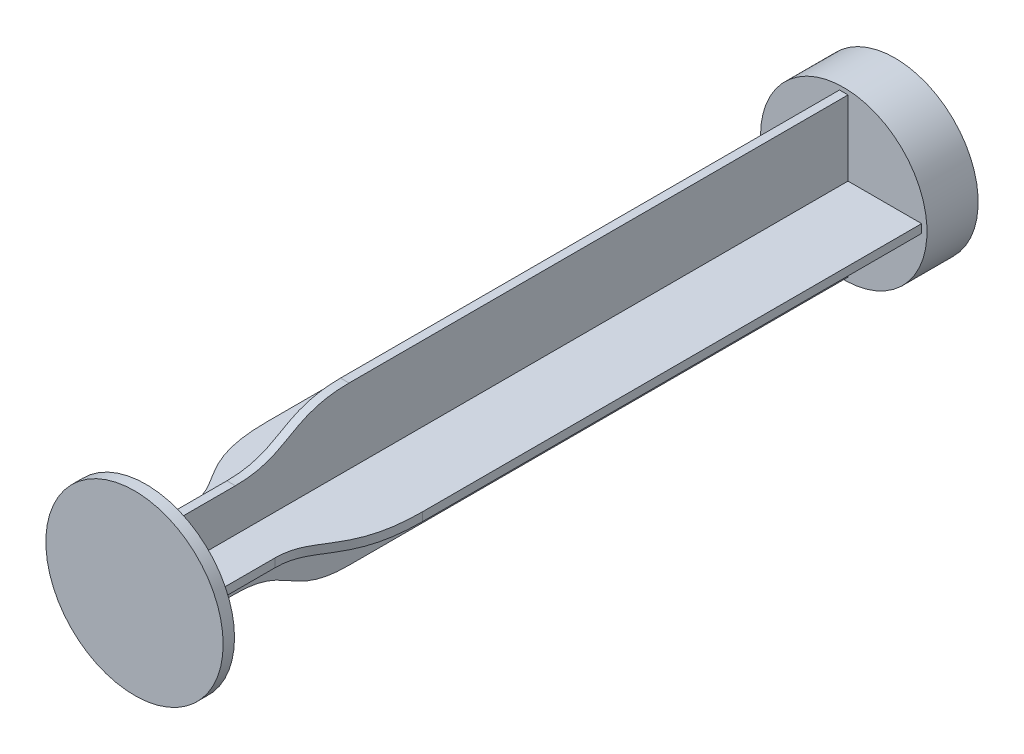
ISO-10303-21;
HEADER;
FILE_DESCRIPTION(('STEP AP214'),'2;1');
FILE_NAME('part.step','',(''),(''),'','','');
FILE_SCHEMA(('AUTOMOTIVE_DESIGN { 1 0 10303 214 1 1 1 1 }'));
ENDSEC;
DATA;
#1=APPLICATION_CONTEXT('core data for automotive mechanical design processes');
#2=APPLICATION_PROTOCOL_DEFINITION('international standard','automotive_design',2000,#1);
#3=PRODUCT_CONTEXT('',#1,'mechanical');
#4=PRODUCT('Part','Part','',(#3));
#5=PRODUCT_RELATED_PRODUCT_CATEGORY('part','',(#4));
#6=PRODUCT_DEFINITION_FORMATION('','',#4);
#7=PRODUCT_DEFINITION_CONTEXT('part definition',#1,'design');
#8=PRODUCT_DEFINITION('design','',#6,#7);
#9=PRODUCT_DEFINITION_SHAPE('','',#8);
#10=(LENGTH_UNIT() NAMED_UNIT(*) SI_UNIT(.MILLI.,.METRE.));
#11=(NAMED_UNIT(*) PLANE_ANGLE_UNIT() SI_UNIT($,.RADIAN.));
#12=(NAMED_UNIT(*) SI_UNIT($,.STERADIAN.) SOLID_ANGLE_UNIT());
#13=UNCERTAINTY_MEASURE_WITH_UNIT(LENGTH_MEASURE(1.E-05),#10,'distance_accuracy_value','');
#14=(GEOMETRIC_REPRESENTATION_CONTEXT(3) GLOBAL_UNCERTAINTY_ASSIGNED_CONTEXT((#13)) GLOBAL_UNIT_ASSIGNED_CONTEXT((#10,
#11,#12)) REPRESENTATION_CONTEXT('',''));
#15=CARTESIAN_POINT('',(0.,0.,0.));
#16=DIRECTION('',(0.,0.,1.));
#17=DIRECTION('',(1.,0.,0.));
#18=AXIS2_PLACEMENT_3D('',#15,#16,#17);
#19=CARTESIAN_POINT('',(-0.750000000000001,-0.75,39.0138466948438));
#20=DIRECTION('',(0.,-1.,0.));
#21=DIRECTION('',(1.,0.,0.));
#22=AXIS2_PLACEMENT_3D('',#19,#20,#21);
#23=PLANE('',#22);
#24=DIRECTION('',(-1.,0.,0.));
#25=VECTOR('',#24,1.);
#26=CARTESIAN_POINT('',(-0.750000000000001,-0.75,0.));
#27=LINE('',#26,#25);
#28=CARTESIAN_POINT('',(-0.750000000000001,-0.749999999999999,0.));
#29=VERTEX_POINT('',#28);
#30=CARTESIAN_POINT('',(-7.75,-0.749999999999997,0.));
#31=VERTEX_POINT('',#30);
#32=EDGE_CURVE('E219',#29,#31,#27,.T.);
#33=ORIENTED_EDGE('',*,*,#32,.T.);
#34=DIRECTION('',(0.,0.,-1.));
#35=VECTOR('',#34,1.);
#36=CARTESIAN_POINT('',(-7.75,-0.749999999999997,0.));
#37=LINE('',#36,#35);
#38=CARTESIAN_POINT('',(-7.75,-0.749999999999997,-15.));
#39=VERTEX_POINT('',#38);
#40=EDGE_CURVE('E627',#31,#39,#37,.T.);
#41=ORIENTED_EDGE('',*,*,#40,.T.);
#42=CARTESIAN_POINT('',(-7.75,-0.749999999999997,-15.));
#43=CARTESIAN_POINT('',(-7.75,-0.749999999999997,-21.9666750683278));
#44=CARTESIAN_POINT('',(-13.7,-0.749999999999995,-21.9666750683278));
#45=CARTESIAN_POINT('',(-13.7,-0.749999999999995,-35.));
#46=B_SPLINE_CURVE_WITH_KNOTS('',3,(#42,#43,#44,#45),.UNSPECIFIED.,.F.,.F.,(4,4),(0.,1.),.UNSPECIFIED.);
#47=CARTESIAN_POINT('',(-13.7,-0.749999999999995,-35.));
#48=VERTEX_POINT('',#47);
#49=EDGE_CURVE('E630',#39,#48,#46,.T.);
#50=ORIENTED_EDGE('',*,*,#49,.T.);
#51=DIRECTION('',(0.,0.,-1.));
#52=VECTOR('',#51,1.);
#53=CARTESIAN_POINT('',(-13.7,-0.750000000000004,39.0138466948438));
#54=LINE('',#53,#52);
#55=CARTESIAN_POINT('',(-13.7,-0.750000000000004,-122.8));
#56=VERTEX_POINT('',#55);
#57=EDGE_CURVE('E217',#48,#56,#54,.T.);
#58=ORIENTED_EDGE('',*,*,#57,.T.);
#59=DIRECTION('',(-1.,0.,0.));
#60=VECTOR('',#59,1.);
#61=CARTESIAN_POINT('',(-0.750000000000001,-0.75,-122.8));
#62=LINE('',#61,#60);
#63=CARTESIAN_POINT('',(-0.750000000000001,-0.75,-122.8));
#64=VERTEX_POINT('',#63);
#65=EDGE_CURVE('E298',#64,#56,#62,.T.);
#66=ORIENTED_EDGE('',*,*,#65,.F.);
#67=DIRECTION('',(0.,0.,-1.));
#68=VECTOR('',#67,1.);
#69=CARTESIAN_POINT('',(-0.750000000000001,-0.75,39.0138466948438));
#70=LINE('',#69,#68);
#71=EDGE_CURVE('E220',#29,#64,#70,.T.);
#72=ORIENTED_EDGE('',*,*,#71,.F.);
#73=EDGE_LOOP('',(#33,#41,#50,#58,#66,#72));
#74=FACE_BOUND('',#73,.T.);
#75=ADVANCED_FACE('F39',(#74),#23,.T.);
#76=CARTESIAN_POINT('',(-13.7,-0.750000000000004,39.0138466948438));
#77=DIRECTION('',(-1.,0.,0.));
#78=DIRECTION('',(0.,0.,1.));
#79=AXIS2_PLACEMENT_3D('',#76,#77,#78);
#80=PLANE('',#79);
#81=ORIENTED_EDGE('',*,*,#57,.F.);
#82=DIRECTION('',(0.,-1.,0.));
#83=VECTOR('',#82,1.);
#84=CARTESIAN_POINT('',(-13.7,38.2134110764713,-35.));
#85=LINE('',#84,#83);
#86=CARTESIAN_POINT('',(-13.7,0.749999999999994,-35.));
#87=VERTEX_POINT('',#86);
#88=EDGE_CURVE('E628',#87,#48,#85,.T.);
#89=ORIENTED_EDGE('',*,*,#88,.F.);
#90=DIRECTION('',(0.,0.,-1.));
#91=VECTOR('',#90,1.);
#92=CARTESIAN_POINT('',(-13.7,0.749999999999996,39.0138466948438));
#93=LINE('',#92,#91);
#94=CARTESIAN_POINT('',(-13.7,0.749999999999996,-122.8));
#95=VERTEX_POINT('',#94);
#96=EDGE_CURVE('E215',#87,#95,#93,.T.);
#97=ORIENTED_EDGE('',*,*,#96,.T.);
#98=DIRECTION('',(0.,1.,0.));
#99=VECTOR('',#98,1.);
#100=CARTESIAN_POINT('',(-13.7,-0.750000000000004,-122.8));
#101=LINE('',#100,#99);
#102=EDGE_CURVE('E295',#56,#95,#101,.T.);
#103=ORIENTED_EDGE('',*,*,#102,.F.);
#104=EDGE_LOOP('',(#81,#89,#97,#103));
#105=FACE_BOUND('',#104,.T.);
#106=ADVANCED_FACE('F412',(#105),#80,.T.);
#107=CARTESIAN_POINT('',(-0.750000000000001,0.75,39.0138466948438));
#108=DIRECTION('',(0.,1.,0.));
#109=DIRECTION('',(-1.,0.,0.));
#110=AXIS2_PLACEMENT_3D('',#107,#108,#109);
#111=PLANE('',#110);
#112=CARTESIAN_POINT('',(-7.75,0.750000000000008,-15.));
#113=CARTESIAN_POINT('',(-7.75,0.750000000000008,-21.9666750683278));
#114=CARTESIAN_POINT('',(-13.7,0.750000000000008,-21.9666750683278));
#115=CARTESIAN_POINT('',(-13.7,0.750000000000008,-35.));
#116=B_SPLINE_CURVE_WITH_KNOTS('',3,(#112,#113,#114,#115),.UNSPECIFIED.,.F.,.F.,(4,4),(0.,1.),.UNSPECIFIED.);
#117=CARTESIAN_POINT('',(-7.75,0.750000000000008,-15.));
#118=VERTEX_POINT('',#117);
#119=EDGE_CURVE('E634',#118,#87,#116,.T.);
#120=ORIENTED_EDGE('',*,*,#119,.F.);
#121=DIRECTION('',(0.,0.,-1.));
#122=VECTOR('',#121,1.);
#123=CARTESIAN_POINT('',(-7.75,0.749999999999994,0.));
#124=LINE('',#123,#122);
#125=CARTESIAN_POINT('',(-7.74999999999999,0.749999999999991,0.));
#126=VERTEX_POINT('',#125);
#127=EDGE_CURVE('E335',#126,#118,#124,.T.);
#128=ORIENTED_EDGE('',*,*,#127,.F.);
#129=DIRECTION('',(1.,0.,0.));
#130=VECTOR('',#129,1.);
#131=CARTESIAN_POINT('',(-0.750000000000001,0.75,0.));
#132=LINE('',#131,#130);
#133=CARTESIAN_POINT('',(-0.750000000000001,0.75,0.));
#134=VERTEX_POINT('',#133);
#135=EDGE_CURVE('E214',#126,#134,#132,.T.);
#136=ORIENTED_EDGE('',*,*,#135,.T.);
#137=DIRECTION('',(0.,0.,-1.));
#138=VECTOR('',#137,1.);
#139=CARTESIAN_POINT('',(-0.750000000000001,0.75,39.0138466948438));
#140=LINE('',#139,#138);
#141=CARTESIAN_POINT('',(-0.750000000000001,0.75,-122.8));
#142=VERTEX_POINT('',#141);
#143=EDGE_CURVE('E210',#134,#142,#140,.T.);
#144=ORIENTED_EDGE('',*,*,#143,.T.);
#145=DIRECTION('',(1.,0.,0.));
#146=VECTOR('',#145,1.);
#147=CARTESIAN_POINT('',(-0.750000000000001,0.75,-122.8));
#148=LINE('',#147,#146);
#149=EDGE_CURVE('E232',#95,#142,#148,.T.);
#150=ORIENTED_EDGE('',*,*,#149,.F.);
#151=ORIENTED_EDGE('',*,*,#96,.F.);
#152=EDGE_LOOP('',(#120,#128,#136,#144,#150,#151));
#153=FACE_BOUND('',#152,.T.);
#154=ADVANCED_FACE('F330',(#153),#111,.T.);
#155=CARTESIAN_POINT('',(0.75,13.8863263133989,39.0138466948438));
#156=DIRECTION('',(0.,1.,0.));
#157=DIRECTION('',(0.,0.,1.));
#158=AXIS2_PLACEMENT_3D('',#155,#156,#157);
#159=PLANE('',#158);
#160=DIRECTION('',(0.,0.,-1.));
#161=VECTOR('',#160,1.);
#162=CARTESIAN_POINT('',(-0.75,13.8863263133989,39.0138466948438));
#163=LINE('',#162,#161);
#164=CARTESIAN_POINT('',(-0.75,13.8863263133989,-35.));
#165=VERTEX_POINT('',#164);
#166=CARTESIAN_POINT('',(-0.75,13.8863263133989,-122.8));
#167=VERTEX_POINT('',#166);
#168=EDGE_CURVE('E233',#165,#167,#163,.T.);
#169=ORIENTED_EDGE('',*,*,#168,.F.);
#170=DIRECTION('',(-1.,0.,0.));
#171=VECTOR('',#170,1.);
#172=CARTESIAN_POINT('',(37.5267487837656,13.8863263133989,-35.));
#173=LINE('',#172,#171);
#174=CARTESIAN_POINT('',(0.750000000000001,13.8863263133989,-35.));
#175=VERTEX_POINT('',#174);
#176=EDGE_CURVE('E362',#175,#165,#173,.T.);
#177=ORIENTED_EDGE('',*,*,#176,.F.);
#178=DIRECTION('',(0.,0.,-1.));
#179=VECTOR('',#178,1.);
#180=CARTESIAN_POINT('',(0.75,13.8863263133989,39.0138466948438));
#181=LINE('',#180,#179);
#182=CARTESIAN_POINT('',(0.75,13.8863263133989,-122.8));
#183=VERTEX_POINT('',#182);
#184=EDGE_CURVE('E209',#175,#183,#181,.T.);
#185=ORIENTED_EDGE('',*,*,#184,.T.);
#186=DIRECTION('',(1.,0.,0.));
#187=VECTOR('',#186,1.);
#188=CARTESIAN_POINT('',(0.75,13.8863263133989,-122.8));
#189=LINE('',#188,#187);
#190=EDGE_CURVE('E321',#167,#183,#189,.T.);
#191=ORIENTED_EDGE('',*,*,#190,.F.);
#192=EDGE_LOOP('',(#169,#177,#185,#191));
#193=FACE_BOUND('',#192,.T.);
#194=ADVANCED_FACE('F411',(#193),#159,.T.);
#195=CARTESIAN_POINT('',(0.750000000000001,0.75,39.0138466948438));
#196=DIRECTION('',(1.,0.,0.));
#197=DIRECTION('',(0.,1.,0.));
#198=AXIS2_PLACEMENT_3D('',#195,#196,#197);
#199=PLANE('',#198);
#200=CARTESIAN_POINT('',(0.750000000000001,8.22801913158162,-15.));
#201=CARTESIAN_POINT('',(0.750000000000001,8.22801913158162,-24.489612622273));
#202=CARTESIAN_POINT('',(0.750000000000001,13.8863263133989,-24.489612622273));
#203=CARTESIAN_POINT('',(0.750000000000001,13.8863263133989,-35.));
#204=B_SPLINE_CURVE_WITH_KNOTS('',3,(#200,#201,#202,#203),.UNSPECIFIED.,.F.,.F.,(4,4),(0.,1.),.UNSPECIFIED.);
#205=CARTESIAN_POINT('',(0.750000000000001,8.22801913158162,-15.));
#206=VERTEX_POINT('',#205);
#207=EDGE_CURVE('E292',#206,#175,#204,.T.);
#208=ORIENTED_EDGE('',*,*,#207,.F.);
#209=DIRECTION('',(0.,0.,-1.));
#210=VECTOR('',#209,1.);
#211=CARTESIAN_POINT('',(0.750000000000001,8.22801913158162,0.));
#212=LINE('',#211,#210);
#213=CARTESIAN_POINT('',(0.750000000000001,8.22801913158162,0.));
#214=VERTEX_POINT('',#213);
#215=EDGE_CURVE('E358',#214,#206,#212,.T.);
#216=ORIENTED_EDGE('',*,*,#215,.F.);
#217=DIRECTION('',(0.,-1.,0.));
#218=VECTOR('',#217,1.);
#219=CARTESIAN_POINT('',(0.750000000000001,0.75,0.));
#220=LINE('',#219,#218);
#221=CARTESIAN_POINT('',(0.750000000000001,0.75,0.));
#222=VERTEX_POINT('',#221);
#223=EDGE_CURVE('E203',#214,#222,#220,.T.);
#224=ORIENTED_EDGE('',*,*,#223,.T.);
#225=DIRECTION('',(0.,0.,-1.));
#226=VECTOR('',#225,1.);
#227=CARTESIAN_POINT('',(0.750000000000001,0.75,39.0138466948438));
#228=LINE('',#227,#226);
#229=CARTESIAN_POINT('',(0.750000000000001,0.75,-122.8));
#230=VERTEX_POINT('',#229);
#231=EDGE_CURVE('E198',#222,#230,#228,.T.);
#232=ORIENTED_EDGE('',*,*,#231,.T.);
#233=DIRECTION('',(0.,-1.,0.));
#234=VECTOR('',#233,1.);
#235=CARTESIAN_POINT('',(0.750000000000001,0.75,-122.8));
#236=LINE('',#235,#234);
#237=EDGE_CURVE('E319',#183,#230,#236,.T.);
#238=ORIENTED_EDGE('',*,*,#237,.F.);
#239=ORIENTED_EDGE('',*,*,#184,.F.);
#240=EDGE_LOOP('',(#208,#216,#224,#232,#238,#239));
#241=FACE_BOUND('',#240,.T.);
#242=ADVANCED_FACE('F408',(#241),#199,.T.);
#243=CARTESIAN_POINT('',(-0.750000000000001,0.75,39.0138466948438));
#244=DIRECTION('',(-1.,0.,0.));
#245=DIRECTION('',(0.,-1.,0.));
#246=AXIS2_PLACEMENT_3D('',#243,#244,#245);
#247=PLANE('',#246);
#248=DIRECTION('',(0.,1.,0.));
#249=VECTOR('',#248,1.);
#250=CARTESIAN_POINT('',(-0.750000000000001,0.75,0.));
#251=LINE('',#250,#249);
#252=CARTESIAN_POINT('',(-0.75,8.22801913158162,0.));
#253=VERTEX_POINT('',#252);
#254=EDGE_CURVE('E213',#134,#253,#251,.T.);
#255=ORIENTED_EDGE('',*,*,#254,.T.);
#256=DIRECTION('',(0.,0.,-1.));
#257=VECTOR('',#256,1.);
#258=CARTESIAN_POINT('',(-0.75,8.22801913158162,0.));
#259=LINE('',#258,#257);
#260=CARTESIAN_POINT('',(-0.75,8.22801913158162,-15.));
#261=VERTEX_POINT('',#260);
#262=EDGE_CURVE('E342',#253,#261,#259,.T.);
#263=ORIENTED_EDGE('',*,*,#262,.T.);
#264=CARTESIAN_POINT('',(-0.75,8.22801913158162,-15.));
#265=CARTESIAN_POINT('',(-0.75,8.22801913158162,-24.489612622273));
#266=CARTESIAN_POINT('',(-0.75,13.8863263133989,-24.489612622273));
#267=CARTESIAN_POINT('',(-0.75,13.8863263133989,-35.));
#268=B_SPLINE_CURVE_WITH_KNOTS('',3,(#264,#265,#266,#267),.UNSPECIFIED.,.F.,.F.,(4,4),(0.,1.),.UNSPECIFIED.);
#269=EDGE_CURVE('E348',#261,#165,#268,.T.);
#270=ORIENTED_EDGE('',*,*,#269,.T.);
#271=ORIENTED_EDGE('',*,*,#168,.T.);
#272=DIRECTION('',(0.,1.,0.));
#273=VECTOR('',#272,1.);
#274=CARTESIAN_POINT('',(-0.750000000000001,0.75,-122.8));
#275=LINE('',#274,#273);
#276=EDGE_CURVE('E246',#142,#167,#275,.T.);
#277=ORIENTED_EDGE('',*,*,#276,.F.);
#278=ORIENTED_EDGE('',*,*,#143,.F.);
#279=EDGE_LOOP('',(#255,#263,#270,#271,#277,#278));
#280=FACE_BOUND('',#279,.T.);
#281=ADVANCED_FACE('F327',(#280),#247,.T.);
#282=CARTESIAN_POINT('',(0.,0.,2.));
#283=DIRECTION('',(0.,0.,-1.));
#284=DIRECTION('',(-1.,0.,0.));
#285=AXIS2_PLACEMENT_3D('',#282,#283,#284);
#286=CYLINDRICAL_SURFACE('',#285,15.6);
#287=CARTESIAN_POINT('',(0.,0.,2.));
#288=DIRECTION('',(0.,0.,1.));
#289=DIRECTION('',(1.,0.,0.));
#290=AXIS2_PLACEMENT_3D('',#287,#288,#289);
#291=CIRCLE('',#290,15.6);
#292=CARTESIAN_POINT('',(15.6,0.,2.));
#293=VERTEX_POINT('',#292);
#294=EDGE_CURVE('E11',#293,#293,#291,.T.);
#295=ORIENTED_EDGE('',*,*,#294,.F.);
#296=EDGE_LOOP('',(#295));
#297=FACE_BOUND('',#296,.T.);
#298=CARTESIAN_POINT('',(0.,0.,0.));
#299=DIRECTION('',(0.,0.,1.));
#300=DIRECTION('',(1.,0.,0.));
#301=AXIS2_PLACEMENT_3D('',#298,#299,#300);
#302=CIRCLE('',#301,15.6);
#303=CARTESIAN_POINT('',(15.6,0.,0.));
#304=VERTEX_POINT('',#303);
#305=EDGE_CURVE('E43',#304,#304,#302,.T.);
#306=ORIENTED_EDGE('',*,*,#305,.T.);
#307=EDGE_LOOP('',(#306));
#308=FACE_BOUND('',#307,.T.);
#309=ADVANCED_FACE('F41',(#297,#308),#286,.T.);
#310=CARTESIAN_POINT('',(0.,0.,2.));
#311=DIRECTION('',(0.,0.,1.));
#312=DIRECTION('',(1.,0.,0.));
#313=AXIS2_PLACEMENT_3D('',#310,#311,#312);
#314=PLANE('',#313);
#315=ORIENTED_EDGE('',*,*,#294,.T.);
#316=EDGE_LOOP('',(#315));
#317=FACE_BOUND('',#316,.T.);
#318=ADVANCED_FACE('F444',(#317),#314,.T.);
#319=CARTESIAN_POINT('',(0.,0.,0.));
#320=DIRECTION('',(0.,0.,1.));
#321=DIRECTION('',(1.,0.,0.));
#322=AXIS2_PLACEMENT_3D('',#319,#320,#321);
#323=PLANE('',#322);
#324=ORIENTED_EDGE('',*,*,#305,.F.);
#325=EDGE_LOOP('',(#324));
#326=FACE_BOUND('',#325,.T.);
#327=DIRECTION('',(0.,-1.,0.));
#328=VECTOR('',#327,1.);
#329=CARTESIAN_POINT('',(7.75000000000001,38.2134110764713,0.));
#330=LINE('',#329,#328);
#331=CARTESIAN_POINT('',(7.75,0.750000000000001,0.));
#332=VERTEX_POINT('',#331);
#333=CARTESIAN_POINT('',(7.75,-0.750000000000002,0.));
#334=VERTEX_POINT('',#333);
#335=EDGE_CURVE('E179',#332,#334,#330,.T.);
#336=ORIENTED_EDGE('',*,*,#335,.F.);
#337=DIRECTION('',(1.,0.,0.));
#338=VECTOR('',#337,1.);
#339=CARTESIAN_POINT('',(13.7,0.750000000000004,0.));
#340=LINE('',#339,#338);
#341=EDGE_CURVE('E190',#222,#332,#340,.T.);
#342=ORIENTED_EDGE('',*,*,#341,.F.);
#343=ORIENTED_EDGE('',*,*,#223,.F.);
#344=DIRECTION('',(-1.,0.,0.));
#345=VECTOR('',#344,1.);
#346=CARTESIAN_POINT('',(37.5267487837656,8.22801913158162,0.));
#347=LINE('',#346,#345);
#348=EDGE_CURVE('E279',#214,#253,#347,.T.);
#349=ORIENTED_EDGE('',*,*,#348,.T.);
#350=ORIENTED_EDGE('',*,*,#254,.F.);
#351=ORIENTED_EDGE('',*,*,#135,.F.);
#352=DIRECTION('',(0.,-1.,0.));
#353=VECTOR('',#352,1.);
#354=CARTESIAN_POINT('',(-7.74999999999999,38.2134110764713,0.));
#355=LINE('',#354,#353);
#356=EDGE_CURVE('E336',#126,#31,#355,.T.);
#357=ORIENTED_EDGE('',*,*,#356,.T.);
#358=ORIENTED_EDGE('',*,*,#32,.F.);
#359=DIRECTION('',(0.,1.,0.));
#360=VECTOR('',#359,1.);
#361=CARTESIAN_POINT('',(-0.75,-13.8863263133989,0.));
#362=LINE('',#361,#360);
#363=CARTESIAN_POINT('',(-0.75,-8.22801913158162,0.));
#364=VERTEX_POINT('',#363);
#365=EDGE_CURVE('E222',#364,#29,#362,.T.);
#366=ORIENTED_EDGE('',*,*,#365,.F.);
#367=DIRECTION('',(-1.,0.,0.));
#368=VECTOR('',#367,1.);
#369=CARTESIAN_POINT('',(37.5267487837656,-8.22801913158162,0.));
#370=LINE('',#369,#368);
#371=CARTESIAN_POINT('',(0.75,-8.22801913158162,0.));
#372=VERTEX_POINT('',#371);
#373=EDGE_CURVE('E62',#372,#364,#370,.T.);
#374=ORIENTED_EDGE('',*,*,#373,.F.);
#375=DIRECTION('',(0.,-1.,0.));
#376=VECTOR('',#375,1.);
#377=CARTESIAN_POINT('',(0.75,-13.8863263133989,0.));
#378=LINE('',#377,#376);
#379=CARTESIAN_POINT('',(0.750000000000001,-0.75,0.));
#380=VERTEX_POINT('',#379);
#381=EDGE_CURVE('E227',#380,#372,#378,.T.);
#382=ORIENTED_EDGE('',*,*,#381,.F.);
#383=DIRECTION('',(-1.,0.,0.));
#384=VECTOR('',#383,1.);
#385=CARTESIAN_POINT('',(13.7,-0.750000000000004,0.));
#386=LINE('',#385,#384);
#387=EDGE_CURVE('E192',#334,#380,#386,.T.);
#388=ORIENTED_EDGE('',*,*,#387,.F.);
#389=EDGE_LOOP('',(#336,#342,#343,#349,#350,#351,#357,#358,#366,#374,#382,#388));
#390=FACE_BOUND('',#389,.T.);
#391=ADVANCED_FACE('F188',(#326,#390),#323,.F.);
#392=CARTESIAN_POINT('',(13.7,0.750000000000004,39.0138466948438));
#393=DIRECTION('',(0.,1.,0.));
#394=DIRECTION('',(-1.,0.,0.));
#395=AXIS2_PLACEMENT_3D('',#392,#393,#394);
#396=PLANE('',#395);
#397=DIRECTION('',(0.,0.,-1.));
#398=VECTOR('',#397,1.);
#399=CARTESIAN_POINT('',(7.75,0.750000000000001,0.));
#400=LINE('',#399,#398);
#401=CARTESIAN_POINT('',(7.75,0.750000000000001,-15.));
#402=VERTEX_POINT('',#401);
#403=EDGE_CURVE('E176',#332,#402,#400,.T.);
#404=ORIENTED_EDGE('',*,*,#403,.T.);
#405=CARTESIAN_POINT('',(7.75,0.750000000000001,-15.));
#406=CARTESIAN_POINT('',(7.75,0.750000000000001,-21.9666750683278));
#407=CARTESIAN_POINT('',(13.7,0.750000000000001,-21.9666750683278));
#408=CARTESIAN_POINT('',(13.7,0.750000000000001,-35.));
#409=B_SPLINE_CURVE_WITH_KNOTS('',3,(#405,#406,#407,#408),.UNSPECIFIED.,.F.,.F.,(4,4),(0.,1.),.UNSPECIFIED.);
#410=CARTESIAN_POINT('',(13.7,0.750000000000001,-35.));
#411=VERTEX_POINT('',#410);
#412=EDGE_CURVE('E660',#402,#411,#409,.T.);
#413=ORIENTED_EDGE('',*,*,#412,.T.);
#414=DIRECTION('',(0.,0.,-1.));
#415=VECTOR('',#414,1.);
#416=CARTESIAN_POINT('',(13.7,0.750000000000004,39.0138466948438));
#417=LINE('',#416,#415);
#418=CARTESIAN_POINT('',(13.7,0.750000000000004,-122.8));
#419=VERTEX_POINT('',#418);
#420=EDGE_CURVE('E199',#411,#419,#417,.T.);
#421=ORIENTED_EDGE('',*,*,#420,.T.);
#422=DIRECTION('',(1.,0.,0.));
#423=VECTOR('',#422,1.);
#424=CARTESIAN_POINT('',(13.7,0.750000000000004,-122.8));
#425=LINE('',#424,#423);
#426=EDGE_CURVE('E316',#230,#419,#425,.T.);
#427=ORIENTED_EDGE('',*,*,#426,.F.);
#428=ORIENTED_EDGE('',*,*,#231,.F.);
#429=ORIENTED_EDGE('',*,*,#341,.T.);
#430=EDGE_LOOP('',(#404,#413,#421,#427,#428,#429));
#431=FACE_BOUND('',#430,.T.);
#432=ADVANCED_FACE('F196',(#431),#396,.T.);
#433=CARTESIAN_POINT('',(13.7,-0.750000000000004,39.0138466948438));
#434=DIRECTION('',(1.,0.,0.));
#435=DIRECTION('',(0.,0.,-1.));
#436=AXIS2_PLACEMENT_3D('',#433,#434,#435);
#437=PLANE('',#436);
#438=DIRECTION('',(0.,-1.,0.));
#439=VECTOR('',#438,1.);
#440=CARTESIAN_POINT('',(13.7,38.2134110764713,-35.));
#441=LINE('',#440,#439);
#442=CARTESIAN_POINT('',(13.7,-0.750000000000004,-35.));
#443=VERTEX_POINT('',#442);
#444=EDGE_CURVE('E658',#411,#443,#441,.T.);
#445=ORIENTED_EDGE('',*,*,#444,.T.);
#446=DIRECTION('',(0.,0.,-1.));
#447=VECTOR('',#446,1.);
#448=CARTESIAN_POINT('',(13.7,-0.750000000000004,39.0138466948438));
#449=LINE('',#448,#447);
#450=CARTESIAN_POINT('',(13.7,-0.750000000000004,-122.8));
#451=VERTEX_POINT('',#450);
#452=EDGE_CURVE('E201',#443,#451,#449,.T.);
#453=ORIENTED_EDGE('',*,*,#452,.T.);
#454=DIRECTION('',(0.,-1.,0.));
#455=VECTOR('',#454,1.);
#456=CARTESIAN_POINT('',(13.7,-0.750000000000004,-122.8));
#457=LINE('',#456,#455);
#458=EDGE_CURVE('E313',#419,#451,#457,.T.);
#459=ORIENTED_EDGE('',*,*,#458,.F.);
#460=ORIENTED_EDGE('',*,*,#420,.F.);
#461=EDGE_LOOP('',(#445,#453,#459,#460));
#462=FACE_BOUND('',#461,.T.);
#463=ADVANCED_FACE('F431',(#462),#437,.T.);
#464=CARTESIAN_POINT('',(13.7,-0.750000000000004,39.0138466948438));
#465=DIRECTION('',(0.,-1.,0.));
#466=DIRECTION('',(1.,0.,0.));
#467=AXIS2_PLACEMENT_3D('',#464,#465,#466);
#468=PLANE('',#467);
#469=DIRECTION('',(0.,0.,-1.));
#470=VECTOR('',#469,1.);
#471=CARTESIAN_POINT('',(7.75,-0.750000000000002,0.));
#472=LINE('',#471,#470);
#473=CARTESIAN_POINT('',(7.75,-0.750000000000001,-15.));
#474=VERTEX_POINT('',#473);
#475=EDGE_CURVE('E54',#334,#474,#472,.T.);
#476=ORIENTED_EDGE('',*,*,#475,.F.);
#477=ORIENTED_EDGE('',*,*,#387,.T.);
#478=DIRECTION('',(0.,0.,-1.));
#479=VECTOR('',#478,1.);
#480=CARTESIAN_POINT('',(0.750000000000001,-0.75,39.0138466948438));
#481=LINE('',#480,#479);
#482=CARTESIAN_POINT('',(0.750000000000001,-0.75,-122.8));
#483=VERTEX_POINT('',#482);
#484=EDGE_CURVE('E228',#380,#483,#481,.T.);
#485=ORIENTED_EDGE('',*,*,#484,.T.);
#486=DIRECTION('',(-1.,0.,0.));
#487=VECTOR('',#486,1.);
#488=CARTESIAN_POINT('',(13.7,-0.750000000000004,-122.8));
#489=LINE('',#488,#487);
#490=EDGE_CURVE('E310',#451,#483,#489,.T.);
#491=ORIENTED_EDGE('',*,*,#490,.F.);
#492=ORIENTED_EDGE('',*,*,#452,.F.);
#493=CARTESIAN_POINT('',(7.75,-0.750000000000002,-15.));
#494=CARTESIAN_POINT('',(7.75,-0.750000000000002,-21.9666750683278));
#495=CARTESIAN_POINT('',(13.7,-0.750000000000004,-21.9666750683278));
#496=CARTESIAN_POINT('',(13.7,-0.750000000000004,-35.));
#497=B_SPLINE_CURVE_WITH_KNOTS('',3,(#493,#494,#495,#496),.UNSPECIFIED.,.F.,.F.,(4,4),(0.,1.),.UNSPECIFIED.);
#498=EDGE_CURVE('E193',#474,#443,#497,.T.);
#499=ORIENTED_EDGE('',*,*,#498,.F.);
#500=EDGE_LOOP('',(#476,#477,#485,#491,#492,#499));
#501=FACE_BOUND('',#500,.T.);
#502=ADVANCED_FACE('F428',(#501),#468,.T.);
#503=CARTESIAN_POINT('',(0.75,-13.8863263133989,39.0138466948438));
#504=DIRECTION('',(1.,0.,0.));
#505=DIRECTION('',(0.,1.,0.));
#506=AXIS2_PLACEMENT_3D('',#503,#504,#505);
#507=PLANE('',#506);
#508=CARTESIAN_POINT('',(0.750000000000001,-8.22801913158162,-15.));
#509=CARTESIAN_POINT('',(0.750000000000001,-8.22801913158162,-24.489612622273));
#510=CARTESIAN_POINT('',(0.750000000000001,-13.8863263133989,-24.489612622273));
#511=CARTESIAN_POINT('',(0.750000000000001,-13.8863263133989,-35.));
#512=B_SPLINE_CURVE_WITH_KNOTS('',3,(#508,#509,#510,#511),.UNSPECIFIED.,.F.,.F.,(4,4),(0.,1.),.UNSPECIFIED.);
#513=CARTESIAN_POINT('',(0.750000000000001,-8.22801913158162,-15.));
#514=VERTEX_POINT('',#513);
#515=CARTESIAN_POINT('',(0.750000000000001,-13.8863263133989,-35.));
#516=VERTEX_POINT('',#515);
#517=EDGE_CURVE('E264',#514,#516,#512,.T.);
#518=ORIENTED_EDGE('',*,*,#517,.T.);
#519=DIRECTION('',(0.,0.,-1.));
#520=VECTOR('',#519,1.);
#521=CARTESIAN_POINT('',(0.75,-13.8863263133989,39.0138466948438));
#522=LINE('',#521,#520);
#523=CARTESIAN_POINT('',(0.75,-13.8863263133989,-122.8));
#524=VERTEX_POINT('',#523);
#525=EDGE_CURVE('E225',#516,#524,#522,.T.);
#526=ORIENTED_EDGE('',*,*,#525,.T.);
#527=DIRECTION('',(0.,-1.,0.));
#528=VECTOR('',#527,1.);
#529=CARTESIAN_POINT('',(0.75,-13.8863263133989,-122.8));
#530=LINE('',#529,#528);
#531=EDGE_CURVE('E307',#483,#524,#530,.T.);
#532=ORIENTED_EDGE('',*,*,#531,.F.);
#533=ORIENTED_EDGE('',*,*,#484,.F.);
#534=ORIENTED_EDGE('',*,*,#381,.T.);
#535=DIRECTION('',(0.,0.,-1.));
#536=VECTOR('',#535,1.);
#537=CARTESIAN_POINT('',(0.750000000000001,-8.22801913158162,0.));
#538=LINE('',#537,#536);
#539=EDGE_CURVE('E257',#372,#514,#538,.T.);
#540=ORIENTED_EDGE('',*,*,#539,.T.);
#541=EDGE_LOOP('',(#518,#526,#532,#533,#534,#540));
#542=FACE_BOUND('',#541,.T.);
#543=ADVANCED_FACE('F256',(#542),#507,.T.);
#544=CARTESIAN_POINT('',(0.75,-13.8863263133989,39.0138466948438));
#545=DIRECTION('',(0.,-1.,0.));
#546=DIRECTION('',(0.,0.,-1.));
#547=AXIS2_PLACEMENT_3D('',#544,#545,#546);
#548=PLANE('',#547);
#549=DIRECTION('',(-1.,0.,0.));
#550=VECTOR('',#549,1.);
#551=CARTESIAN_POINT('',(37.5267487837656,-13.8863263133989,-35.));
#552=LINE('',#551,#550);
#553=CARTESIAN_POINT('',(-0.750000000000001,-13.8863263133989,-35.));
#554=VERTEX_POINT('',#553);
#555=EDGE_CURVE('E261',#516,#554,#552,.T.);
#556=ORIENTED_EDGE('',*,*,#555,.T.);
#557=DIRECTION('',(0.,0.,-1.));
#558=VECTOR('',#557,1.);
#559=CARTESIAN_POINT('',(-0.75,-13.8863263133989,39.0138466948438));
#560=LINE('',#559,#558);
#561=CARTESIAN_POINT('',(-0.75,-13.8863263133989,-122.8));
#562=VERTEX_POINT('',#561);
#563=EDGE_CURVE('E223',#554,#562,#560,.T.);
#564=ORIENTED_EDGE('',*,*,#563,.T.);
#565=DIRECTION('',(-1.,0.,0.));
#566=VECTOR('',#565,1.);
#567=CARTESIAN_POINT('',(0.75,-13.8863263133989,-122.8));
#568=LINE('',#567,#566);
#569=EDGE_CURVE('E304',#524,#562,#568,.T.);
#570=ORIENTED_EDGE('',*,*,#569,.F.);
#571=ORIENTED_EDGE('',*,*,#525,.F.);
#572=EDGE_LOOP('',(#556,#564,#570,#571));
#573=FACE_BOUND('',#572,.T.);
#574=ADVANCED_FACE('F421',(#573),#548,.T.);
#575=CARTESIAN_POINT('',(-0.75,-13.8863263133989,39.0138466948438));
#576=DIRECTION('',(-1.,0.,0.));
#577=DIRECTION('',(0.,-1.,0.));
#578=AXIS2_PLACEMENT_3D('',#575,#576,#577);
#579=PLANE('',#578);
#580=CARTESIAN_POINT('',(-0.750000000000001,-8.22801913158162,-15.));
#581=CARTESIAN_POINT('',(-0.750000000000001,-8.22801913158162,-24.489612622273));
#582=CARTESIAN_POINT('',(-0.750000000000001,-13.8863263133989,-24.489612622273));
#583=CARTESIAN_POINT('',(-0.750000000000001,-13.8863263133989,-35.));
#584=B_SPLINE_CURVE_WITH_KNOTS('',3,(#580,#581,#582,#583),.UNSPECIFIED.,.F.,.F.,(4,4),(0.,1.),.UNSPECIFIED.);
#585=CARTESIAN_POINT('',(-0.750000000000001,-8.22801913158162,-15.));
#586=VERTEX_POINT('',#585);
#587=EDGE_CURVE('E273',#586,#554,#584,.T.);
#588=ORIENTED_EDGE('',*,*,#587,.F.);
#589=DIRECTION('',(0.,0.,-1.));
#590=VECTOR('',#589,1.);
#591=CARTESIAN_POINT('',(-0.750000000000001,-8.22801913158162,0.));
#592=LINE('',#591,#590);
#593=EDGE_CURVE('E274',#364,#586,#592,.T.);
#594=ORIENTED_EDGE('',*,*,#593,.F.);
#595=ORIENTED_EDGE('',*,*,#365,.T.);
#596=ORIENTED_EDGE('',*,*,#71,.T.);
#597=DIRECTION('',(0.,1.,0.));
#598=VECTOR('',#597,1.);
#599=CARTESIAN_POINT('',(-0.75,-13.8863263133989,-122.8));
#600=LINE('',#599,#598);
#601=EDGE_CURVE('E301',#562,#64,#600,.T.);
#602=ORIENTED_EDGE('',*,*,#601,.F.);
#603=ORIENTED_EDGE('',*,*,#563,.F.);
#604=EDGE_LOOP('',(#588,#594,#595,#596,#602,#603));
#605=FACE_BOUND('',#604,.T.);
#606=ADVANCED_FACE('F401',(#605),#579,.T.);
#607=CARTESIAN_POINT('',(0.,0.,-122.8));
#608=DIRECTION('',(0.,0.,-1.));
#609=DIRECTION('',(-1.,0.,0.));
#610=AXIS2_PLACEMENT_3D('',#607,#608,#609);
#611=PLANE('',#610);
#612=CARTESIAN_POINT('',(0.,0.,-122.8));
#613=DIRECTION('',(0.,0.,-1.));
#614=DIRECTION('',(-1.,0.,0.));
#615=AXIS2_PLACEMENT_3D('',#612,#613,#614);
#616=CIRCLE('',#615,14.65);
#617=CARTESIAN_POINT('',(-14.65,0.,-122.8));
#618=VERTEX_POINT('',#617);
#619=EDGE_CURVE('E289',#618,#618,#616,.T.);
#620=ORIENTED_EDGE('',*,*,#619,.F.);
#621=EDGE_LOOP('',(#620));
#622=FACE_BOUND('',#621,.T.);
#623=ORIENTED_EDGE('',*,*,#149,.T.);
#624=ORIENTED_EDGE('',*,*,#276,.T.);
#625=ORIENTED_EDGE('',*,*,#190,.T.);
#626=ORIENTED_EDGE('',*,*,#237,.T.);
#627=ORIENTED_EDGE('',*,*,#426,.T.);
#628=ORIENTED_EDGE('',*,*,#458,.T.);
#629=ORIENTED_EDGE('',*,*,#490,.T.);
#630=ORIENTED_EDGE('',*,*,#531,.T.);
#631=ORIENTED_EDGE('',*,*,#569,.T.);
#632=ORIENTED_EDGE('',*,*,#601,.T.);
#633=ORIENTED_EDGE('',*,*,#65,.T.);
#634=ORIENTED_EDGE('',*,*,#102,.T.);
#635=EDGE_LOOP('',(#623,#624,#625,#626,#627,#628,#629,#630,#631,#632,#633,#634));
#636=FACE_BOUND('',#635,.T.);
#637=ADVANCED_FACE('F325',(#622,#636),#611,.F.);
#638=CARTESIAN_POINT('',(0.,0.,-131.8));
#639=DIRECTION('',(0.,0.,1.));
#640=DIRECTION('',(1.,0.,0.));
#641=AXIS2_PLACEMENT_3D('',#638,#639,#640);
#642=CYLINDRICAL_SURFACE('',#641,14.65);
#643=CARTESIAN_POINT('',(0.,0.,-131.8));
#644=DIRECTION('',(0.,0.,-1.));
#645=DIRECTION('',(-1.,0.,0.));
#646=AXIS2_PLACEMENT_3D('',#643,#644,#645);
#647=CIRCLE('',#646,14.65);
#648=CARTESIAN_POINT('',(-14.65,0.,-131.8));
#649=VERTEX_POINT('',#648);
#650=EDGE_CURVE('E283',#649,#649,#647,.T.);
#651=ORIENTED_EDGE('',*,*,#650,.F.);
#652=EDGE_LOOP('',(#651));
#653=FACE_BOUND('',#652,.T.);
#654=ORIENTED_EDGE('',*,*,#619,.T.);
#655=EDGE_LOOP('',(#654));
#656=FACE_BOUND('',#655,.T.);
#657=ADVANCED_FACE('F397',(#653,#656),#642,.T.);
#658=CARTESIAN_POINT('',(0.,0.,-131.8));
#659=DIRECTION('',(0.,0.,-1.));
#660=DIRECTION('',(-1.,0.,0.));
#661=AXIS2_PLACEMENT_3D('',#658,#659,#660);
#662=PLANE('',#661);
#663=ORIENTED_EDGE('',*,*,#650,.T.);
#664=EDGE_LOOP('',(#663));
#665=FACE_BOUND('',#664,.T.);
#666=ADVANCED_FACE('F387',(#665),#662,.T.);
#667=CARTESIAN_POINT('',(37.5267487837656,8.22801913158162,0.));
#668=DIRECTION('',(0.,1.,0.));
#669=DIRECTION('',(0.,0.,1.));
#670=AXIS2_PLACEMENT_3D('',#667,#668,#669);
#671=PLANE('',#670);
#672=ORIENTED_EDGE('',*,*,#215,.T.);
#673=DIRECTION('',(-1.,0.,0.));
#674=VECTOR('',#673,1.);
#675=CARTESIAN_POINT('',(37.5267487837656,8.22801913158162,-15.));
#676=LINE('',#675,#674);
#677=EDGE_CURVE('E345',#206,#261,#676,.T.);
#678=ORIENTED_EDGE('',*,*,#677,.T.);
#679=ORIENTED_EDGE('',*,*,#262,.F.);
#680=ORIENTED_EDGE('',*,*,#348,.F.);
#681=EDGE_LOOP('',(#672,#678,#679,#680));
#682=FACE_BOUND('',#681,.T.);
#683=ADVANCED_FACE('F344',(#682),#671,.T.);
#684=CARTESIAN_POINT('',(37.5267487837656,8.22801913158162,-15.));
#685=CARTESIAN_POINT('',(37.5267487837656,8.22801913158162,-24.489612622273));
#686=CARTESIAN_POINT('',(37.5267487837656,13.8863263133989,-24.489612622273));
#687=CARTESIAN_POINT('',(37.5267487837656,13.8863263133989,-35.));
#688=B_SPLINE_CURVE_WITH_KNOTS('',3,(#684,#685,#686,#687),.UNSPECIFIED.,.F.,.F.,(4,4),(0.,1.),.UNSPECIFIED.);
#689=DIRECTION('',(-1.,0.,0.));
#690=VECTOR('',#689,1.);
#691=SURFACE_OF_LINEAR_EXTRUSION('',#688,#690);
#692=ORIENTED_EDGE('',*,*,#207,.T.);
#693=ORIENTED_EDGE('',*,*,#176,.T.);
#694=ORIENTED_EDGE('',*,*,#269,.F.);
#695=ORIENTED_EDGE('',*,*,#677,.F.);
#696=EDGE_LOOP('',(#692,#693,#694,#695));
#697=FACE_BOUND('',#696,.T.);
#698=ADVANCED_FACE('F376',(#697),#691,.T.);
#699=CARTESIAN_POINT('',(37.5267487837656,-8.22801913158162,-15.));
#700=CARTESIAN_POINT('',(37.5267487837656,-8.22801913158162,-24.489612622273));
#701=CARTESIAN_POINT('',(37.5267487837656,-13.8863263133989,-24.489612622273));
#702=CARTESIAN_POINT('',(37.5267487837656,-13.8863263133989,-35.));
#703=B_SPLINE_CURVE_WITH_KNOTS('',3,(#699,#700,#701,#702),.UNSPECIFIED.,.F.,.F.,(4,4),(0.,1.),.UNSPECIFIED.);
#704=DIRECTION('',(-1.,0.,0.));
#705=VECTOR('',#704,1.);
#706=SURFACE_OF_LINEAR_EXTRUSION('',#703,#705);
#707=DIRECTION('',(-1.,0.,0.));
#708=VECTOR('',#707,1.);
#709=CARTESIAN_POINT('',(37.5267487837656,-8.22801913158162,-15.));
#710=LINE('',#709,#708);
#711=EDGE_CURVE('E266',#514,#586,#710,.T.);
#712=ORIENTED_EDGE('',*,*,#711,.T.);
#713=ORIENTED_EDGE('',*,*,#587,.T.);
#714=ORIENTED_EDGE('',*,*,#555,.F.);
#715=ORIENTED_EDGE('',*,*,#517,.F.);
#716=EDGE_LOOP('',(#712,#713,#714,#715));
#717=FACE_BOUND('',#716,.T.);
#718=ADVANCED_FACE('F380',(#717),#706,.F.);
#719=CARTESIAN_POINT('',(37.5267487837656,-8.22801913158162,0.));
#720=DIRECTION('',(0.,1.,0.));
#721=DIRECTION('',(0.,0.,1.));
#722=AXIS2_PLACEMENT_3D('',#719,#720,#721);
#723=PLANE('',#722);
#724=ORIENTED_EDGE('',*,*,#373,.T.);
#725=ORIENTED_EDGE('',*,*,#593,.T.);
#726=ORIENTED_EDGE('',*,*,#711,.F.);
#727=ORIENTED_EDGE('',*,*,#539,.F.);
#728=EDGE_LOOP('',(#724,#725,#726,#727));
#729=FACE_BOUND('',#728,.T.);
#730=ADVANCED_FACE('F390',(#729),#723,.F.);
#731=CARTESIAN_POINT('',(-7.74999999999999,38.2134110764713,0.));
#732=DIRECTION('',(-1.,0.,0.));
#733=DIRECTION('',(0.,-1.,0.));
#734=AXIS2_PLACEMENT_3D('',#731,#732,#733);
#735=PLANE('',#734);
#736=ORIENTED_EDGE('',*,*,#127,.T.);
#737=DIRECTION('',(0.,-1.,0.));
#738=VECTOR('',#737,1.);
#739=CARTESIAN_POINT('',(-7.74999999999999,38.2134110764713,-15.));
#740=LINE('',#739,#738);
#741=EDGE_CURVE('E631',#118,#39,#740,.T.);
#742=ORIENTED_EDGE('',*,*,#741,.T.);
#743=ORIENTED_EDGE('',*,*,#40,.F.);
#744=ORIENTED_EDGE('',*,*,#356,.F.);
#745=EDGE_LOOP('',(#736,#742,#743,#744));
#746=FACE_BOUND('',#745,.T.);
#747=ADVANCED_FACE('F394',(#746),#735,.T.);
#748=CARTESIAN_POINT('',(-7.74999999999999,38.2134110764713,-15.));
#749=CARTESIAN_POINT('',(-7.74999999999999,38.2134110764713,-21.9666750683278));
#750=CARTESIAN_POINT('',(-13.7,38.2134110764713,-21.9666750683278));
#751=CARTESIAN_POINT('',(-13.7,38.2134110764713,-35.));
#752=B_SPLINE_CURVE_WITH_KNOTS('',3,(#748,#749,#750,#751),.UNSPECIFIED.,.F.,.F.,(4,4),(0.,1.),.UNSPECIFIED.);
#753=DIRECTION('',(0.,-1.,0.));
#754=VECTOR('',#753,1.);
#755=SURFACE_OF_LINEAR_EXTRUSION('',#752,#754);
#756=ORIENTED_EDGE('',*,*,#119,.T.);
#757=ORIENTED_EDGE('',*,*,#88,.T.);
#758=ORIENTED_EDGE('',*,*,#49,.F.);
#759=ORIENTED_EDGE('',*,*,#741,.F.);
#760=EDGE_LOOP('',(#756,#757,#758,#759));
#761=FACE_BOUND('',#760,.T.);
#762=ADVANCED_FACE('F382',(#761),#755,.T.);
#763=CARTESIAN_POINT('',(7.75000000000001,38.2134110764713,0.));
#764=DIRECTION('',(-1.,0.,0.));
#765=DIRECTION('',(0.,-1.,0.));
#766=AXIS2_PLACEMENT_3D('',#763,#764,#765);
#767=PLANE('',#766);
#768=ORIENTED_EDGE('',*,*,#335,.T.);
#769=ORIENTED_EDGE('',*,*,#475,.T.);
#770=DIRECTION('',(0.,-1.,0.));
#771=VECTOR('',#770,1.);
#772=CARTESIAN_POINT('',(7.75000000000001,38.2134110764713,-15.));
#773=LINE('',#772,#771);
#774=EDGE_CURVE('E180',#402,#474,#773,.T.);
#775=ORIENTED_EDGE('',*,*,#774,.F.);
#776=ORIENTED_EDGE('',*,*,#403,.F.);
#777=EDGE_LOOP('',(#768,#769,#775,#776));
#778=FACE_BOUND('',#777,.T.);
#779=ADVANCED_FACE('F178',(#778),#767,.F.);
#780=CARTESIAN_POINT('',(7.75000000000001,38.2134110764713,-15.));
#781=CARTESIAN_POINT('',(7.75000000000002,38.2134110764713,-21.9666750683278));
#782=CARTESIAN_POINT('',(13.7,38.2134110764713,-21.9666750683278));
#783=CARTESIAN_POINT('',(13.7,38.2134110764713,-35.));
#784=B_SPLINE_CURVE_WITH_KNOTS('',3,(#780,#781,#782,#783),.UNSPECIFIED.,.F.,.F.,(4,4),(0.,1.),.UNSPECIFIED.);
#785=DIRECTION('',(0.,-1.,0.));
#786=VECTOR('',#785,1.);
#787=SURFACE_OF_LINEAR_EXTRUSION('',#784,#786);
#788=ORIENTED_EDGE('',*,*,#774,.T.);
#789=ORIENTED_EDGE('',*,*,#498,.T.);
#790=ORIENTED_EDGE('',*,*,#444,.F.);
#791=ORIENTED_EDGE('',*,*,#412,.F.);
#792=EDGE_LOOP('',(#788,#789,#790,#791));
#793=FACE_BOUND('',#792,.T.);
#794=ADVANCED_FACE('F597',(#793),#787,.F.);
#795=CLOSED_SHELL('',(#75,#106,#154,#194,#242,#281,#309,#318,#391,#432,#463,#502,#543,#574,#606,
#637,#657,#666,#683,#698,#718,#730,#747,#762,#779,#794));
#796=MANIFOLD_SOLID_BREP('B2',#795);
#797=ADVANCED_BREP_SHAPE_REPRESENTATION('',(#18,#796),#14);
#798=SHAPE_DEFINITION_REPRESENTATION(#9,#797);
ENDSEC;
END-ISO-10303-21;
